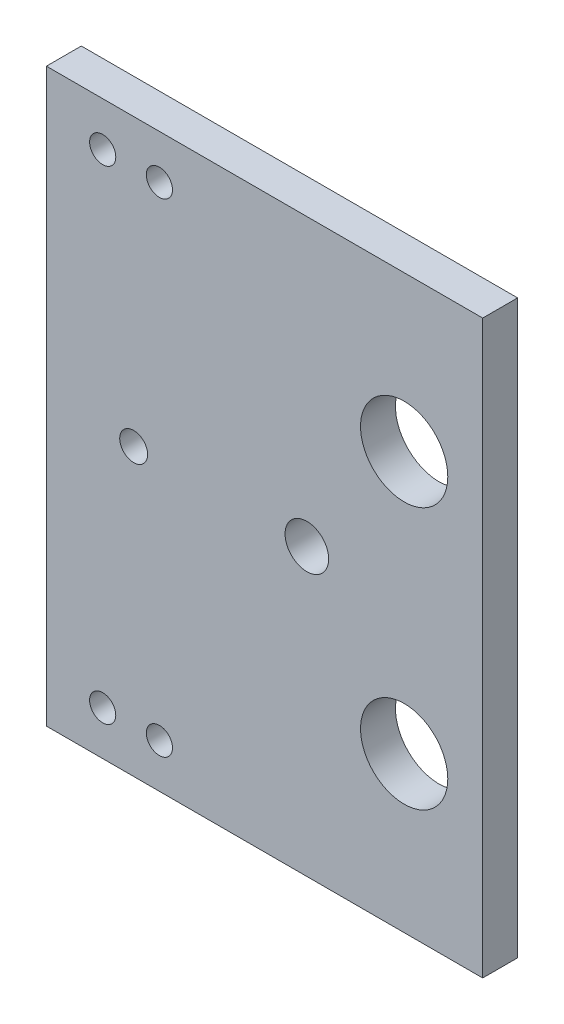
ISO-10303-21;
HEADER;
FILE_DESCRIPTION(('STEP AP214'),'2;1');
FILE_NAME('part.step','',(''),(''),'','','');
FILE_SCHEMA(('AUTOMOTIVE_DESIGN { 1 0 10303 214 1 1 1 1 }'));
ENDSEC;
DATA;
#1=APPLICATION_CONTEXT('core data for automotive mechanical design processes');
#2=APPLICATION_PROTOCOL_DEFINITION('international standard','automotive_design',2000,#1);
#3=PRODUCT_CONTEXT('',#1,'mechanical');
#4=PRODUCT('Part','Part','',(#3));
#5=PRODUCT_RELATED_PRODUCT_CATEGORY('part','',(#4));
#6=PRODUCT_DEFINITION_FORMATION('','',#4);
#7=PRODUCT_DEFINITION_CONTEXT('part definition',#1,'design');
#8=PRODUCT_DEFINITION('design','',#6,#7);
#9=PRODUCT_DEFINITION_SHAPE('','',#8);
#10=(LENGTH_UNIT() NAMED_UNIT(*) SI_UNIT(.MILLI.,.METRE.));
#11=(NAMED_UNIT(*) PLANE_ANGLE_UNIT() SI_UNIT($,.RADIAN.));
#12=(NAMED_UNIT(*) SI_UNIT($,.STERADIAN.) SOLID_ANGLE_UNIT());
#13=UNCERTAINTY_MEASURE_WITH_UNIT(LENGTH_MEASURE(1.E-05),#10,'distance_accuracy_value','');
#14=(GEOMETRIC_REPRESENTATION_CONTEXT(3) GLOBAL_UNCERTAINTY_ASSIGNED_CONTEXT((#13)) GLOBAL_UNIT_ASSIGNED_CONTEXT((#10,
#11,#12)) REPRESENTATION_CONTEXT('',''));
#15=CARTESIAN_POINT('',(0.,0.,0.));
#16=DIRECTION('',(0.,0.,1.));
#17=DIRECTION('',(1.,0.,0.));
#18=AXIS2_PLACEMENT_3D('',#15,#16,#17);
#19=CARTESIAN_POINT('',(0.,0.,4.));
#20=DIRECTION('',(-1.,0.,0.));
#21=DIRECTION('',(0.,0.,1.));
#22=AXIS2_PLACEMENT_3D('',#19,#20,#21);
#23=PLANE('',#22);
#24=DIRECTION('',(0.,1.,0.));
#25=VECTOR('',#24,1.);
#26=CARTESIAN_POINT('',(0.,0.,0.));
#27=LINE('',#26,#25);
#28=CARTESIAN_POINT('',(0.,0.,0.));
#29=VERTEX_POINT('',#28);
#30=CARTESIAN_POINT('',(0.,65.5,0.));
#31=VERTEX_POINT('',#30);
#32=EDGE_CURVE('E102',#29,#31,#27,.T.);
#33=ORIENTED_EDGE('',*,*,#32,.T.);
#34=DIRECTION('',(0.,0.,-1.));
#35=VECTOR('',#34,1.);
#36=CARTESIAN_POINT('',(0.,65.5,4.));
#37=LINE('',#36,#35);
#38=CARTESIAN_POINT('',(0.,65.5,4.));
#39=VERTEX_POINT('',#38);
#40=EDGE_CURVE('E11',#39,#31,#37,.T.);
#41=ORIENTED_EDGE('',*,*,#40,.F.);
#42=DIRECTION('',(0.,1.,0.));
#43=VECTOR('',#42,1.);
#44=CARTESIAN_POINT('',(0.,0.,4.));
#45=LINE('',#44,#43);
#46=CARTESIAN_POINT('',(0.,0.,4.));
#47=VERTEX_POINT('',#46);
#48=EDGE_CURVE('E89',#47,#39,#45,.T.);
#49=ORIENTED_EDGE('',*,*,#48,.F.);
#50=DIRECTION('',(0.,0.,-1.));
#51=VECTOR('',#50,1.);
#52=CARTESIAN_POINT('',(0.,0.,4.));
#53=LINE('',#52,#51);
#54=EDGE_CURVE('E98',#47,#29,#53,.T.);
#55=ORIENTED_EDGE('',*,*,#54,.T.);
#56=EDGE_LOOP('',(#33,#41,#49,#55));
#57=FACE_BOUND('',#56,.T.);
#58=ADVANCED_FACE('F36',(#57),#23,.F.);
#59=CARTESIAN_POINT('',(0.,65.5,4.));
#60=DIRECTION('',(0.,-1.,0.));
#61=DIRECTION('',(0.,0.,-1.));
#62=AXIS2_PLACEMENT_3D('',#59,#60,#61);
#63=PLANE('',#62);
#64=DIRECTION('',(-1.,0.,0.));
#65=VECTOR('',#64,1.);
#66=CARTESIAN_POINT('',(0.,65.5,0.));
#67=LINE('',#66,#65);
#68=CARTESIAN_POINT('',(-50.,65.5,0.));
#69=VERTEX_POINT('',#68);
#70=EDGE_CURVE('E93',#31,#69,#67,.T.);
#71=ORIENTED_EDGE('',*,*,#70,.T.);
#72=DIRECTION('',(0.,0.,-1.));
#73=VECTOR('',#72,1.);
#74=CARTESIAN_POINT('',(-50.,65.5,4.));
#75=LINE('',#74,#73);
#76=CARTESIAN_POINT('',(-50.,65.5,4.));
#77=VERTEX_POINT('',#76);
#78=EDGE_CURVE('E45',#77,#69,#75,.T.);
#79=ORIENTED_EDGE('',*,*,#78,.F.);
#80=DIRECTION('',(-1.,0.,0.));
#81=VECTOR('',#80,1.);
#82=CARTESIAN_POINT('',(0.,65.5,4.));
#83=LINE('',#82,#81);
#84=EDGE_CURVE('E84',#39,#77,#83,.T.);
#85=ORIENTED_EDGE('',*,*,#84,.F.);
#86=ORIENTED_EDGE('',*,*,#40,.T.);
#87=EDGE_LOOP('',(#71,#79,#85,#86));
#88=FACE_BOUND('',#87,.T.);
#89=ADVANCED_FACE('F92',(#88),#63,.F.);
#90=CARTESIAN_POINT('',(-50.,0.,4.));
#91=DIRECTION('',(1.,0.,0.));
#92=DIRECTION('',(0.,0.,-1.));
#93=AXIS2_PLACEMENT_3D('',#90,#91,#92);
#94=PLANE('',#93);
#95=DIRECTION('',(0.,-1.,0.));
#96=VECTOR('',#95,1.);
#97=CARTESIAN_POINT('',(-50.,0.,0.));
#98=LINE('',#97,#96);
#99=CARTESIAN_POINT('',(-50.,0.,0.));
#100=VERTEX_POINT('',#99);
#101=EDGE_CURVE('E71',#69,#100,#98,.T.);
#102=ORIENTED_EDGE('',*,*,#101,.T.);
#103=DIRECTION('',(0.,0.,-1.));
#104=VECTOR('',#103,1.);
#105=CARTESIAN_POINT('',(-50.,0.,4.));
#106=LINE('',#105,#104);
#107=CARTESIAN_POINT('',(-50.,0.,4.));
#108=VERTEX_POINT('',#107);
#109=EDGE_CURVE('E94',#108,#100,#106,.T.);
#110=ORIENTED_EDGE('',*,*,#109,.F.);
#111=DIRECTION('',(0.,-1.,0.));
#112=VECTOR('',#111,1.);
#113=CARTESIAN_POINT('',(-50.,0.,4.));
#114=LINE('',#113,#112);
#115=EDGE_CURVE('E87',#77,#108,#114,.T.);
#116=ORIENTED_EDGE('',*,*,#115,.F.);
#117=ORIENTED_EDGE('',*,*,#78,.T.);
#118=EDGE_LOOP('',(#102,#110,#116,#117));
#119=FACE_BOUND('',#118,.T.);
#120=ADVANCED_FACE('F96',(#119),#94,.F.);
#121=CARTESIAN_POINT('',(0.,0.,4.));
#122=DIRECTION('',(0.,1.,0.));
#123=DIRECTION('',(-1.,0.,0.));
#124=AXIS2_PLACEMENT_3D('',#121,#122,#123);
#125=PLANE('',#124);
#126=DIRECTION('',(1.,0.,0.));
#127=VECTOR('',#126,1.);
#128=CARTESIAN_POINT('',(0.,0.,0.));
#129=LINE('',#128,#127);
#130=EDGE_CURVE('E77',#100,#29,#129,.T.);
#131=ORIENTED_EDGE('',*,*,#130,.T.);
#132=ORIENTED_EDGE('',*,*,#54,.F.);
#133=DIRECTION('',(1.,0.,0.));
#134=VECTOR('',#133,1.);
#135=CARTESIAN_POINT('',(0.,0.,4.));
#136=LINE('',#135,#134);
#137=EDGE_CURVE('E54',#108,#47,#136,.T.);
#138=ORIENTED_EDGE('',*,*,#137,.F.);
#139=ORIENTED_EDGE('',*,*,#109,.T.);
#140=EDGE_LOOP('',(#131,#132,#138,#139));
#141=FACE_BOUND('',#140,.T.);
#142=ADVANCED_FACE('F166',(#141),#125,.F.);
#143=CARTESIAN_POINT('',(0.,0.,4.));
#144=DIRECTION('',(0.,0.,1.));
#145=DIRECTION('',(1.,0.,0.));
#146=AXIS2_PLACEMENT_3D('',#143,#144,#145);
#147=PLANE('',#146);
#148=CARTESIAN_POINT('',(-43.55,5.04999999999999,4.));
#149=DIRECTION('',(0.,0.,1.));
#150=DIRECTION('',(1.,0.,0.));
#151=AXIS2_PLACEMENT_3D('',#148,#149,#150);
#152=CIRCLE('',#151,1.5);
#153=CARTESIAN_POINT('',(-42.05,5.04999999999999,4.));
#154=VERTEX_POINT('',#153);
#155=EDGE_CURVE('E286',#154,#154,#152,.T.);
#156=ORIENTED_EDGE('',*,*,#155,.F.);
#157=EDGE_LOOP('',(#156));
#158=FACE_BOUND('',#157,.T.);
#159=CARTESIAN_POINT('',(-37.05,5.04999999999999,4.));
#160=DIRECTION('',(0.,0.,1.));
#161=DIRECTION('',(1.,0.,0.));
#162=AXIS2_PLACEMENT_3D('',#159,#160,#161);
#163=CIRCLE('',#162,1.5);
#164=CARTESIAN_POINT('',(-35.55,5.04999999999999,4.));
#165=VERTEX_POINT('',#164);
#166=EDGE_CURVE('E280',#165,#165,#163,.T.);
#167=ORIENTED_EDGE('',*,*,#166,.F.);
#168=EDGE_LOOP('',(#167));
#169=FACE_BOUND('',#168,.T.);
#170=CARTESIAN_POINT('',(-9.,17.75,4.));
#171=DIRECTION('',(0.,0.,1.));
#172=DIRECTION('',(1.,0.,0.));
#173=AXIS2_PLACEMENT_3D('',#170,#171,#172);
#174=CIRCLE('',#173,5.);
#175=CARTESIAN_POINT('',(-4.,17.75,4.));
#176=VERTEX_POINT('',#175);
#177=EDGE_CURVE('E260',#176,#176,#174,.T.);
#178=ORIENTED_EDGE('',*,*,#177,.F.);
#179=EDGE_LOOP('',(#178));
#180=FACE_BOUND('',#179,.T.);
#181=CARTESIAN_POINT('',(-20.15,32.75,4.));
#182=DIRECTION('',(0.,0.,1.));
#183=DIRECTION('',(1.,0.,0.));
#184=AXIS2_PLACEMENT_3D('',#181,#182,#183);
#185=CIRCLE('',#184,2.5);
#186=CARTESIAN_POINT('',(-17.65,32.75,4.));
#187=VERTEX_POINT('',#186);
#188=EDGE_CURVE('E279',#187,#187,#185,.T.);
#189=ORIENTED_EDGE('',*,*,#188,.F.);
#190=EDGE_LOOP('',(#189));
#191=FACE_BOUND('',#190,.T.);
#192=CARTESIAN_POINT('',(-40.,32.75,4.));
#193=DIRECTION('',(0.,0.,1.));
#194=DIRECTION('',(1.,0.,0.));
#195=AXIS2_PLACEMENT_3D('',#192,#193,#194);
#196=CIRCLE('',#195,1.6);
#197=CARTESIAN_POINT('',(-38.4,32.75,4.));
#198=VERTEX_POINT('',#197);
#199=EDGE_CURVE('E283',#198,#198,#196,.T.);
#200=ORIENTED_EDGE('',*,*,#199,.F.);
#201=EDGE_LOOP('',(#200));
#202=FACE_BOUND('',#201,.T.);
#203=CARTESIAN_POINT('',(-43.55,60.45,4.));
#204=DIRECTION('',(0.,0.,1.));
#205=DIRECTION('',(1.,0.,0.));
#206=AXIS2_PLACEMENT_3D('',#203,#204,#205);
#207=CIRCLE('',#206,1.5);
#208=CARTESIAN_POINT('',(-42.05,60.45,4.));
#209=VERTEX_POINT('',#208);
#210=EDGE_CURVE('E295',#209,#209,#207,.T.);
#211=ORIENTED_EDGE('',*,*,#210,.F.);
#212=EDGE_LOOP('',(#211));
#213=FACE_BOUND('',#212,.T.);
#214=CARTESIAN_POINT('',(-37.05,60.45,4.));
#215=DIRECTION('',(0.,0.,1.));
#216=DIRECTION('',(1.,0.,0.));
#217=AXIS2_PLACEMENT_3D('',#214,#215,#216);
#218=CIRCLE('',#217,1.5);
#219=CARTESIAN_POINT('',(-35.55,60.45,4.));
#220=VERTEX_POINT('',#219);
#221=EDGE_CURVE('E292',#220,#220,#218,.T.);
#222=ORIENTED_EDGE('',*,*,#221,.F.);
#223=EDGE_LOOP('',(#222));
#224=FACE_BOUND('',#223,.T.);
#225=CARTESIAN_POINT('',(-9.,47.75,4.));
#226=DIRECTION('',(0.,0.,1.));
#227=DIRECTION('',(1.,0.,0.));
#228=AXIS2_PLACEMENT_3D('',#225,#226,#227);
#229=CIRCLE('',#228,5.);
#230=CARTESIAN_POINT('',(-4.,47.75,4.));
#231=VERTEX_POINT('',#230);
#232=EDGE_CURVE('E114',#231,#231,#229,.T.);
#233=ORIENTED_EDGE('',*,*,#232,.F.);
#234=EDGE_LOOP('',(#233));
#235=FACE_BOUND('',#234,.T.);
#236=ORIENTED_EDGE('',*,*,#48,.T.);
#237=ORIENTED_EDGE('',*,*,#84,.T.);
#238=ORIENTED_EDGE('',*,*,#115,.T.);
#239=ORIENTED_EDGE('',*,*,#137,.T.);
#240=EDGE_LOOP('',(#236,#237,#238,#239));
#241=FACE_BOUND('',#240,.T.);
#242=ADVANCED_FACE('F85',(#158,#169,#180,#191,#202,#213,#224,#235,#241),#147,.T.);
#243=CARTESIAN_POINT('',(0.,0.,0.));
#244=DIRECTION('',(0.,0.,1.));
#245=DIRECTION('',(1.,0.,0.));
#246=AXIS2_PLACEMENT_3D('',#243,#244,#245);
#247=PLANE('',#246);
#248=CARTESIAN_POINT('',(-43.55,5.04999999999999,0.));
#249=DIRECTION('',(0.,0.,1.));
#250=DIRECTION('',(1.,0.,0.));
#251=AXIS2_PLACEMENT_3D('',#248,#249,#250);
#252=CIRCLE('',#251,1.5);
#253=CARTESIAN_POINT('',(-42.05,5.04999999999999,0.));
#254=VERTEX_POINT('',#253);
#255=EDGE_CURVE('E39',#254,#254,#252,.T.);
#256=ORIENTED_EDGE('',*,*,#255,.T.);
#257=EDGE_LOOP('',(#256));
#258=FACE_BOUND('',#257,.T.);
#259=CARTESIAN_POINT('',(-37.05,5.04999999999999,0.));
#260=DIRECTION('',(0.,0.,1.));
#261=DIRECTION('',(1.,0.,0.));
#262=AXIS2_PLACEMENT_3D('',#259,#260,#261);
#263=CIRCLE('',#262,1.5);
#264=CARTESIAN_POINT('',(-35.55,5.04999999999999,0.));
#265=VERTEX_POINT('',#264);
#266=EDGE_CURVE('E128',#265,#265,#263,.T.);
#267=ORIENTED_EDGE('',*,*,#266,.T.);
#268=EDGE_LOOP('',(#267));
#269=FACE_BOUND('',#268,.T.);
#270=CARTESIAN_POINT('',(-9.,17.75,0.));
#271=DIRECTION('',(0.,0.,1.));
#272=DIRECTION('',(1.,0.,0.));
#273=AXIS2_PLACEMENT_3D('',#270,#271,#272);
#274=CIRCLE('',#273,5.);
#275=CARTESIAN_POINT('',(-4.,17.75,0.));
#276=VERTEX_POINT('',#275);
#277=EDGE_CURVE('E126',#276,#276,#274,.T.);
#278=ORIENTED_EDGE('',*,*,#277,.T.);
#279=EDGE_LOOP('',(#278));
#280=FACE_BOUND('',#279,.T.);
#281=CARTESIAN_POINT('',(-20.15,32.75,0.));
#282=DIRECTION('',(0.,0.,1.));
#283=DIRECTION('',(1.,0.,0.));
#284=AXIS2_PLACEMENT_3D('',#281,#282,#283);
#285=CIRCLE('',#284,2.5);
#286=CARTESIAN_POINT('',(-17.65,32.75,0.));
#287=VERTEX_POINT('',#286);
#288=EDGE_CURVE('E123',#287,#287,#285,.T.);
#289=ORIENTED_EDGE('',*,*,#288,.T.);
#290=EDGE_LOOP('',(#289));
#291=FACE_BOUND('',#290,.T.);
#292=CARTESIAN_POINT('',(-40.,32.75,0.));
#293=DIRECTION('',(0.,0.,1.));
#294=DIRECTION('',(1.,0.,0.));
#295=AXIS2_PLACEMENT_3D('',#292,#293,#294);
#296=CIRCLE('',#295,1.6);
#297=CARTESIAN_POINT('',(-38.4,32.75,0.));
#298=VERTEX_POINT('',#297);
#299=EDGE_CURVE('E120',#298,#298,#296,.T.);
#300=ORIENTED_EDGE('',*,*,#299,.T.);
#301=EDGE_LOOP('',(#300));
#302=FACE_BOUND('',#301,.T.);
#303=CARTESIAN_POINT('',(-43.55,60.45,0.));
#304=DIRECTION('',(0.,0.,1.));
#305=DIRECTION('',(1.,0.,0.));
#306=AXIS2_PLACEMENT_3D('',#303,#304,#305);
#307=CIRCLE('',#306,1.5);
#308=CARTESIAN_POINT('',(-42.05,60.45,0.));
#309=VERTEX_POINT('',#308);
#310=EDGE_CURVE('E117',#309,#309,#307,.T.);
#311=ORIENTED_EDGE('',*,*,#310,.T.);
#312=EDGE_LOOP('',(#311));
#313=FACE_BOUND('',#312,.T.);
#314=CARTESIAN_POINT('',(-37.05,60.45,0.));
#315=DIRECTION('',(0.,0.,1.));
#316=DIRECTION('',(1.,0.,0.));
#317=AXIS2_PLACEMENT_3D('',#314,#315,#316);
#318=CIRCLE('',#317,1.5);
#319=CARTESIAN_POINT('',(-35.55,60.45,0.));
#320=VERTEX_POINT('',#319);
#321=EDGE_CURVE('E113',#320,#320,#318,.T.);
#322=ORIENTED_EDGE('',*,*,#321,.T.);
#323=EDGE_LOOP('',(#322));
#324=FACE_BOUND('',#323,.T.);
#325=CARTESIAN_POINT('',(-9.,47.75,0.));
#326=DIRECTION('',(0.,0.,1.));
#327=DIRECTION('',(1.,0.,0.));
#328=AXIS2_PLACEMENT_3D('',#325,#326,#327);
#329=CIRCLE('',#328,5.);
#330=CARTESIAN_POINT('',(-4.,47.75,0.));
#331=VERTEX_POINT('',#330);
#332=EDGE_CURVE('E110',#331,#331,#329,.T.);
#333=ORIENTED_EDGE('',*,*,#332,.T.);
#334=EDGE_LOOP('',(#333));
#335=FACE_BOUND('',#334,.T.);
#336=ORIENTED_EDGE('',*,*,#32,.F.);
#337=ORIENTED_EDGE('',*,*,#130,.F.);
#338=ORIENTED_EDGE('',*,*,#101,.F.);
#339=ORIENTED_EDGE('',*,*,#70,.F.);
#340=EDGE_LOOP('',(#336,#337,#338,#339));
#341=FACE_BOUND('',#340,.T.);
#342=ADVANCED_FACE('F135',(#258,#269,#280,#291,#302,#313,#324,#335,#341),#247,.F.);
#343=CARTESIAN_POINT('',(-9.,47.75,-6.));
#344=DIRECTION('',(0.,0.,1.));
#345=DIRECTION('',(1.,0.,0.));
#346=AXIS2_PLACEMENT_3D('',#343,#344,#345);
#347=CYLINDRICAL_SURFACE('',#346,5.);
#348=ORIENTED_EDGE('',*,*,#232,.T.);
#349=EDGE_LOOP('',(#348));
#350=FACE_BOUND('',#349,.T.);
#351=ORIENTED_EDGE('',*,*,#332,.F.);
#352=EDGE_LOOP('',(#351));
#353=FACE_BOUND('',#352,.T.);
#354=ADVANCED_FACE('F158',(#350,#353),#347,.F.);
#355=CARTESIAN_POINT('',(-37.05,60.45,-6.));
#356=DIRECTION('',(0.,0.,1.));
#357=DIRECTION('',(1.,0.,0.));
#358=AXIS2_PLACEMENT_3D('',#355,#356,#357);
#359=CYLINDRICAL_SURFACE('',#358,1.5);
#360=ORIENTED_EDGE('',*,*,#221,.T.);
#361=EDGE_LOOP('',(#360));
#362=FACE_BOUND('',#361,.T.);
#363=ORIENTED_EDGE('',*,*,#321,.F.);
#364=EDGE_LOOP('',(#363));
#365=FACE_BOUND('',#364,.T.);
#366=ADVANCED_FACE('F164',(#362,#365),#359,.F.);
#367=CARTESIAN_POINT('',(-43.55,60.45,-6.));
#368=DIRECTION('',(0.,0.,1.));
#369=DIRECTION('',(1.,0.,0.));
#370=AXIS2_PLACEMENT_3D('',#367,#368,#369);
#371=CYLINDRICAL_SURFACE('',#370,1.5);
#372=ORIENTED_EDGE('',*,*,#210,.T.);
#373=EDGE_LOOP('',(#372));
#374=FACE_BOUND('',#373,.T.);
#375=ORIENTED_EDGE('',*,*,#310,.F.);
#376=EDGE_LOOP('',(#375));
#377=FACE_BOUND('',#376,.T.);
#378=ADVANCED_FACE('F204',(#374,#377),#371,.F.);
#379=CARTESIAN_POINT('',(-40.,32.75,-6.));
#380=DIRECTION('',(0.,0.,1.));
#381=DIRECTION('',(1.,0.,0.));
#382=AXIS2_PLACEMENT_3D('',#379,#380,#381);
#383=CYLINDRICAL_SURFACE('',#382,1.6);
#384=ORIENTED_EDGE('',*,*,#199,.T.);
#385=EDGE_LOOP('',(#384));
#386=FACE_BOUND('',#385,.T.);
#387=ORIENTED_EDGE('',*,*,#299,.F.);
#388=EDGE_LOOP('',(#387));
#389=FACE_BOUND('',#388,.T.);
#390=ADVANCED_FACE('F214',(#386,#389),#383,.F.);
#391=CARTESIAN_POINT('',(-20.15,32.75,-6.));
#392=DIRECTION('',(0.,0.,1.));
#393=DIRECTION('',(1.,0.,0.));
#394=AXIS2_PLACEMENT_3D('',#391,#392,#393);
#395=CYLINDRICAL_SURFACE('',#394,2.5);
#396=ORIENTED_EDGE('',*,*,#188,.T.);
#397=EDGE_LOOP('',(#396));
#398=FACE_BOUND('',#397,.T.);
#399=ORIENTED_EDGE('',*,*,#288,.F.);
#400=EDGE_LOOP('',(#399));
#401=FACE_BOUND('',#400,.T.);
#402=ADVANCED_FACE('F224',(#398,#401),#395,.F.);
#403=CARTESIAN_POINT('',(-9.,17.75,-6.));
#404=DIRECTION('',(0.,0.,1.));
#405=DIRECTION('',(1.,0.,0.));
#406=AXIS2_PLACEMENT_3D('',#403,#404,#405);
#407=CYLINDRICAL_SURFACE('',#406,5.);
#408=ORIENTED_EDGE('',*,*,#177,.T.);
#409=EDGE_LOOP('',(#408));
#410=FACE_BOUND('',#409,.T.);
#411=ORIENTED_EDGE('',*,*,#277,.F.);
#412=EDGE_LOOP('',(#411));
#413=FACE_BOUND('',#412,.T.);
#414=ADVANCED_FACE('F145',(#410,#413),#407,.F.);
#415=CARTESIAN_POINT('',(-37.05,5.04999999999999,-6.));
#416=DIRECTION('',(0.,0.,1.));
#417=DIRECTION('',(1.,0.,0.));
#418=AXIS2_PLACEMENT_3D('',#415,#416,#417);
#419=CYLINDRICAL_SURFACE('',#418,1.5);
#420=ORIENTED_EDGE('',*,*,#166,.T.);
#421=EDGE_LOOP('',(#420));
#422=FACE_BOUND('',#421,.T.);
#423=ORIENTED_EDGE('',*,*,#266,.F.);
#424=EDGE_LOOP('',(#423));
#425=FACE_BOUND('',#424,.T.);
#426=ADVANCED_FACE('F139',(#422,#425),#419,.F.);
#427=CARTESIAN_POINT('',(-43.55,5.04999999999999,-6.));
#428=DIRECTION('',(0.,0.,1.));
#429=DIRECTION('',(1.,0.,0.));
#430=AXIS2_PLACEMENT_3D('',#427,#428,#429);
#431=CYLINDRICAL_SURFACE('',#430,1.5);
#432=ORIENTED_EDGE('',*,*,#155,.T.);
#433=EDGE_LOOP('',(#432));
#434=FACE_BOUND('',#433,.T.);
#435=ORIENTED_EDGE('',*,*,#255,.F.);
#436=EDGE_LOOP('',(#435));
#437=FACE_BOUND('',#436,.T.);
#438=ADVANCED_FACE('F137',(#434,#437),#431,.F.);
#439=CLOSED_SHELL('',(#58,#89,#120,#142,#242,#342,#354,#366,#378,#390,#402,#414,#426,#438));
#440=MANIFOLD_SOLID_BREP('B2',#439);
#441=ADVANCED_BREP_SHAPE_REPRESENTATION('',(#18,#440),#14);
#442=SHAPE_DEFINITION_REPRESENTATION(#9,#441);
ENDSEC;
END-ISO-10303-21;
